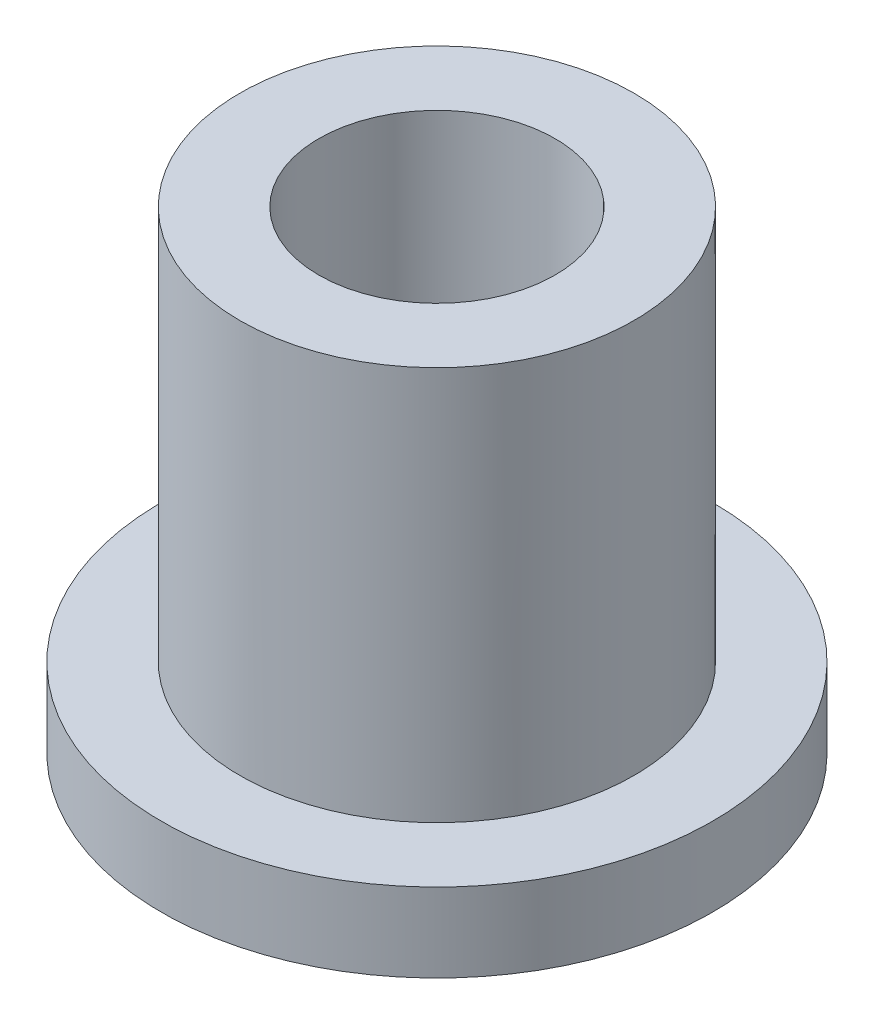
ISO-10303-21;
HEADER;
FILE_DESCRIPTION(('STEP AP214'),'2;1');
FILE_NAME('part.step','',(''),(''),'','','');
FILE_SCHEMA(('AUTOMOTIVE_DESIGN { 1 0 10303 214 1 1 1 1 }'));
ENDSEC;
DATA;
#1=APPLICATION_CONTEXT('core data for automotive mechanical design processes');
#2=APPLICATION_PROTOCOL_DEFINITION('international standard','automotive_design',2000,#1);
#3=PRODUCT_CONTEXT('',#1,'mechanical');
#4=PRODUCT('Part','Part','',(#3));
#5=PRODUCT_RELATED_PRODUCT_CATEGORY('part','',(#4));
#6=PRODUCT_DEFINITION_FORMATION('','',#4);
#7=PRODUCT_DEFINITION_CONTEXT('part definition',#1,'design');
#8=PRODUCT_DEFINITION('design','',#6,#7);
#9=PRODUCT_DEFINITION_SHAPE('','',#8);
#10=(LENGTH_UNIT() NAMED_UNIT(*) SI_UNIT(.MILLI.,.METRE.));
#11=(NAMED_UNIT(*) PLANE_ANGLE_UNIT() SI_UNIT($,.RADIAN.));
#12=(NAMED_UNIT(*) SI_UNIT($,.STERADIAN.) SOLID_ANGLE_UNIT());
#13=UNCERTAINTY_MEASURE_WITH_UNIT(LENGTH_MEASURE(1.E-05),#10,'distance_accuracy_value','');
#14=(GEOMETRIC_REPRESENTATION_CONTEXT(3) GLOBAL_UNCERTAINTY_ASSIGNED_CONTEXT((#13)) GLOBAL_UNIT_ASSIGNED_CONTEXT((#10,
#11,#12)) REPRESENTATION_CONTEXT('',''));
#15=CARTESIAN_POINT('',(0.,0.,0.));
#16=DIRECTION('',(0.,0.,1.));
#17=DIRECTION('',(1.,0.,0.));
#18=AXIS2_PLACEMENT_3D('',#15,#16,#17);
#19=CARTESIAN_POINT('',(0.,12.,0.));
#20=DIRECTION('',(0.,-1.,0.));
#21=DIRECTION('',(0.,0.,-1.));
#22=AXIS2_PLACEMENT_3D('',#19,#20,#21);
#23=CYLINDRICAL_SURFACE('',#22,5.);
#24=CARTESIAN_POINT('',(0.,12.,0.));
#25=DIRECTION('',(0.,1.,0.));
#26=DIRECTION('',(0.,0.,1.));
#27=AXIS2_PLACEMENT_3D('',#24,#25,#26);
#28=CIRCLE('',#27,5.);
#29=CARTESIAN_POINT('',(0.,12.,5.));
#30=VERTEX_POINT('',#29);
#31=EDGE_CURVE('E42',#30,#30,#28,.T.);
#32=ORIENTED_EDGE('',*,*,#31,.F.);
#33=EDGE_LOOP('',(#32));
#34=FACE_BOUND('',#33,.T.);
#35=CARTESIAN_POINT('',(0.,2.,0.));
#36=DIRECTION('',(0.,-1.,0.));
#37=DIRECTION('',(0.,0.,-1.));
#38=AXIS2_PLACEMENT_3D('',#35,#36,#37);
#39=CIRCLE('',#38,5.);
#40=CARTESIAN_POINT('',(0.,2.,-5.));
#41=VERTEX_POINT('',#40);
#42=EDGE_CURVE('E10',#41,#41,#39,.T.);
#43=ORIENTED_EDGE('',*,*,#42,.F.);
#44=EDGE_LOOP('',(#43));
#45=FACE_BOUND('',#44,.T.);
#46=ADVANCED_FACE('F39',(#34,#45),#23,.T.);
#47=CARTESIAN_POINT('',(0.,12.,0.));
#48=DIRECTION('',(0.,1.,0.));
#49=DIRECTION('',(0.,0.,1.));
#50=AXIS2_PLACEMENT_3D('',#47,#48,#49);
#51=PLANE('',#50);
#52=ORIENTED_EDGE('',*,*,#31,.T.);
#53=EDGE_LOOP('',(#52));
#54=FACE_BOUND('',#53,.T.);
#55=CARTESIAN_POINT('',(0.,12.,0.));
#56=DIRECTION('',(0.,1.,0.));
#57=DIRECTION('',(0.,0.,1.));
#58=AXIS2_PLACEMENT_3D('',#55,#56,#57);
#59=CIRCLE('',#58,3.);
#60=CARTESIAN_POINT('',(0.,12.,3.));
#61=VERTEX_POINT('',#60);
#62=EDGE_CURVE('E50',#61,#61,#59,.T.);
#63=ORIENTED_EDGE('',*,*,#62,.F.);
#64=EDGE_LOOP('',(#63));
#65=FACE_BOUND('',#64,.T.);
#66=ADVANCED_FACE('F81',(#54,#65),#51,.T.);
#67=CARTESIAN_POINT('',(0.,0.,0.));
#68=DIRECTION('',(0.,1.,0.));
#69=DIRECTION('',(0.,0.,1.));
#70=AXIS2_PLACEMENT_3D('',#67,#68,#69);
#71=PLANE('',#70);
#72=CARTESIAN_POINT('',(0.,0.,0.));
#73=DIRECTION('',(0.,1.,0.));
#74=DIRECTION('',(0.,0.,1.));
#75=AXIS2_PLACEMENT_3D('',#72,#73,#74);
#76=CIRCLE('',#75,3.);
#77=CARTESIAN_POINT('',(0.,0.,3.));
#78=VERTEX_POINT('',#77);
#79=EDGE_CURVE('E56',#78,#78,#76,.T.);
#80=ORIENTED_EDGE('',*,*,#79,.T.);
#81=EDGE_LOOP('',(#80));
#82=FACE_BOUND('',#81,.T.);
#83=CARTESIAN_POINT('',(0.,0.,0.));
#84=DIRECTION('',(0.,-1.,0.));
#85=DIRECTION('',(0.,0.,-1.));
#86=AXIS2_PLACEMENT_3D('',#83,#84,#85);
#87=CIRCLE('',#86,7.);
#88=CARTESIAN_POINT('',(0.,0.,-7.));
#89=VERTEX_POINT('',#88);
#90=EDGE_CURVE('E53',#89,#89,#87,.T.);
#91=ORIENTED_EDGE('',*,*,#90,.T.);
#92=EDGE_LOOP('',(#91));
#93=FACE_BOUND('',#92,.T.);
#94=ADVANCED_FACE('F67',(#82,#93),#71,.F.);
#95=CARTESIAN_POINT('',(0.,12.,0.));
#96=DIRECTION('',(0.,-1.,0.));
#97=DIRECTION('',(0.,0.,-1.));
#98=AXIS2_PLACEMENT_3D('',#95,#96,#97);
#99=CYLINDRICAL_SURFACE('',#98,3.);
#100=ORIENTED_EDGE('',*,*,#79,.F.);
#101=EDGE_LOOP('',(#100));
#102=FACE_BOUND('',#101,.T.);
#103=ORIENTED_EDGE('',*,*,#62,.T.);
#104=EDGE_LOOP('',(#103));
#105=FACE_BOUND('',#104,.T.);
#106=ADVANCED_FACE('F76',(#102,#105),#99,.F.);
#107=CARTESIAN_POINT('',(0.,2.,0.));
#108=DIRECTION('',(0.,-1.,0.));
#109=DIRECTION('',(0.,0.,-1.));
#110=AXIS2_PLACEMENT_3D('',#107,#108,#109);
#111=PLANE('',#110);
#112=CARTESIAN_POINT('',(0.,2.,0.));
#113=DIRECTION('',(0.,-1.,0.));
#114=DIRECTION('',(0.,0.,-1.));
#115=AXIS2_PLACEMENT_3D('',#112,#113,#114);
#116=CIRCLE('',#115,7.);
#117=CARTESIAN_POINT('',(0.,2.,-7.));
#118=VERTEX_POINT('',#117);
#119=EDGE_CURVE('E58',#118,#118,#116,.T.);
#120=ORIENTED_EDGE('',*,*,#119,.F.);
#121=EDGE_LOOP('',(#120));
#122=FACE_BOUND('',#121,.T.);
#123=ORIENTED_EDGE('',*,*,#42,.T.);
#124=EDGE_LOOP('',(#123));
#125=FACE_BOUND('',#124,.T.);
#126=ADVANCED_FACE('F71',(#122,#125),#111,.F.);
#127=CARTESIAN_POINT('',(0.,2.,0.));
#128=DIRECTION('',(0.,-1.,0.));
#129=DIRECTION('',(0.,0.,-1.));
#130=AXIS2_PLACEMENT_3D('',#127,#128,#129);
#131=CYLINDRICAL_SURFACE('',#130,7.);
#132=ORIENTED_EDGE('',*,*,#119,.T.);
#133=EDGE_LOOP('',(#132));
#134=FACE_BOUND('',#133,.T.);
#135=ORIENTED_EDGE('',*,*,#90,.F.);
#136=EDGE_LOOP('',(#135));
#137=FACE_BOUND('',#136,.T.);
#138=ADVANCED_FACE('F69',(#134,#137),#131,.T.);
#139=CLOSED_SHELL('',(#46,#66,#94,#106,#126,#138));
#140=MANIFOLD_SOLID_BREP('B2',#139);
#141=ADVANCED_BREP_SHAPE_REPRESENTATION('',(#18,#140),#14);
#142=SHAPE_DEFINITION_REPRESENTATION(#9,#141);
ENDSEC;
END-ISO-10303-21;
